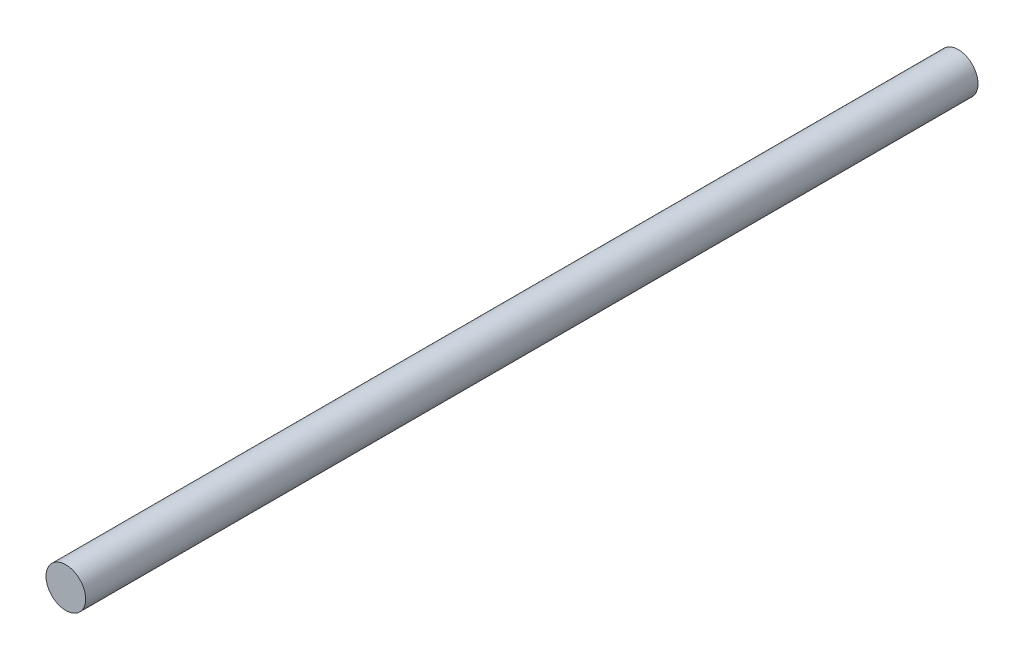
ISO-10303-21;
HEADER;
FILE_DESCRIPTION(('STEP AP214'),'2;1');
FILE_NAME('part.step','',(''),(''),'','','');
FILE_SCHEMA(('AUTOMOTIVE_DESIGN { 1 0 10303 214 1 1 1 1 }'));
ENDSEC;
DATA;
#1=APPLICATION_CONTEXT('core data for automotive mechanical design processes');
#2=APPLICATION_PROTOCOL_DEFINITION('international standard','automotive_design',2000,#1);
#3=PRODUCT_CONTEXT('',#1,'mechanical');
#4=PRODUCT('Part','Part','',(#3));
#5=PRODUCT_RELATED_PRODUCT_CATEGORY('part','',(#4));
#6=PRODUCT_DEFINITION_FORMATION('','',#4);
#7=PRODUCT_DEFINITION_CONTEXT('part definition',#1,'design');
#8=PRODUCT_DEFINITION('design','',#6,#7);
#9=PRODUCT_DEFINITION_SHAPE('','',#8);
#10=(LENGTH_UNIT() NAMED_UNIT(*) SI_UNIT(.MILLI.,.METRE.));
#11=(NAMED_UNIT(*) PLANE_ANGLE_UNIT() SI_UNIT($,.RADIAN.));
#12=(NAMED_UNIT(*) SI_UNIT($,.STERADIAN.) SOLID_ANGLE_UNIT());
#13=UNCERTAINTY_MEASURE_WITH_UNIT(LENGTH_MEASURE(1.E-05),#10,'distance_accuracy_value','');
#14=(GEOMETRIC_REPRESENTATION_CONTEXT(3) GLOBAL_UNCERTAINTY_ASSIGNED_CONTEXT((#13)) GLOBAL_UNIT_ASSIGNED_CONTEXT((#10,
#11,#12)) REPRESENTATION_CONTEXT('',''));
#15=CARTESIAN_POINT('',(0.,0.,0.));
#16=DIRECTION('',(0.,0.,1.));
#17=DIRECTION('',(1.,0.,0.));
#18=AXIS2_PLACEMENT_3D('',#15,#16,#17);
#19=CARTESIAN_POINT('',(0.,0.,180.));
#20=DIRECTION('',(0.,0.,-1.));
#21=DIRECTION('',(-1.,0.,0.));
#22=AXIS2_PLACEMENT_3D('',#19,#20,#21);
#23=CYLINDRICAL_SURFACE('',#22,4.);
#24=CARTESIAN_POINT('',(0.,0.,180.));
#25=DIRECTION('',(0.,0.,1.));
#26=DIRECTION('',(1.,0.,0.));
#27=AXIS2_PLACEMENT_3D('',#24,#25,#26);
#28=CIRCLE('',#27,4.);
#29=CARTESIAN_POINT('',(-4.,0.,180.));
#30=VERTEX_POINT('',#29);
#31=EDGE_CURVE('E10',#30,#30,#28,.T.);
#32=CARTESIAN_POINT('',(0.,0.,0.));
#33=DIRECTION('',(0.,0.,1.));
#34=DIRECTION('',(1.,0.,0.));
#35=AXIS2_PLACEMENT_3D('',#32,#33,#34);
#36=CIRCLE('',#35,4.);
#37=CARTESIAN_POINT('',(-4.,0.,0.));
#38=VERTEX_POINT('',#37);
#39=EDGE_CURVE('E46',#38,#38,#36,.T.);
#40=CARTESIAN_POINT('',(-4.,0.,180.));
#41=CARTESIAN_POINT('',(-4.,0.,178.125));
#42=CARTESIAN_POINT('',(-4.,0.,176.25));
#43=CARTESIAN_POINT('',(-4.,0.,172.5));
#44=CARTESIAN_POINT('',(-4.,0.,170.625));
#45=CARTESIAN_POINT('',(-4.,0.,166.875));
#46=CARTESIAN_POINT('',(-4.,0.,165.));
#47=CARTESIAN_POINT('',(-4.,0.,161.25));
#48=CARTESIAN_POINT('',(-4.,0.,159.375));
#49=CARTESIAN_POINT('',(-4.,0.,155.625));
#50=CARTESIAN_POINT('',(-4.,0.,153.75));
#51=CARTESIAN_POINT('',(-4.,0.,150.));
#52=CARTESIAN_POINT('',(-4.,0.,148.125));
#53=CARTESIAN_POINT('',(-4.,0.,144.375));
#54=CARTESIAN_POINT('',(-4.,0.,142.5));
#55=CARTESIAN_POINT('',(-4.,0.,138.75));
#56=CARTESIAN_POINT('',(-4.,0.,136.875));
#57=CARTESIAN_POINT('',(-4.,0.,133.125));
#58=CARTESIAN_POINT('',(-4.,0.,131.25));
#59=CARTESIAN_POINT('',(-4.,0.,127.5));
#60=CARTESIAN_POINT('',(-4.,0.,125.625));
#61=CARTESIAN_POINT('',(-4.,0.,121.875));
#62=CARTESIAN_POINT('',(-4.,0.,120.));
#63=CARTESIAN_POINT('',(-4.,0.,116.25));
#64=CARTESIAN_POINT('',(-4.,0.,114.375));
#65=CARTESIAN_POINT('',(-4.,0.,110.625));
#66=CARTESIAN_POINT('',(-4.,0.,108.75));
#67=CARTESIAN_POINT('',(-4.,0.,105.));
#68=CARTESIAN_POINT('',(-4.,0.,103.125));
#69=CARTESIAN_POINT('',(-4.,0.,99.375));
#70=CARTESIAN_POINT('',(-4.,0.,97.5));
#71=CARTESIAN_POINT('',(-4.,0.,93.75));
#72=CARTESIAN_POINT('',(-4.,0.,91.875));
#73=CARTESIAN_POINT('',(-4.,0.,88.125));
#74=CARTESIAN_POINT('',(-4.,0.,86.25));
#75=CARTESIAN_POINT('',(-4.,0.,82.5));
#76=CARTESIAN_POINT('',(-4.,0.,80.625));
#77=CARTESIAN_POINT('',(-4.,0.,76.875));
#78=CARTESIAN_POINT('',(-4.,0.,75.));
#79=CARTESIAN_POINT('',(-4.,0.,71.25));
#80=CARTESIAN_POINT('',(-4.,0.,69.375));
#81=CARTESIAN_POINT('',(-4.,0.,65.625));
#82=CARTESIAN_POINT('',(-4.,0.,63.75));
#83=CARTESIAN_POINT('',(-4.,0.,60.));
#84=CARTESIAN_POINT('',(-4.,0.,58.125));
#85=CARTESIAN_POINT('',(-4.,0.,54.375));
#86=CARTESIAN_POINT('',(-4.,0.,52.5));
#87=CARTESIAN_POINT('',(-4.,0.,48.75));
#88=CARTESIAN_POINT('',(-4.,0.,46.875));
#89=CARTESIAN_POINT('',(-4.,0.,43.125));
#90=CARTESIAN_POINT('',(-4.,0.,41.25));
#91=CARTESIAN_POINT('',(-4.,0.,37.5));
#92=CARTESIAN_POINT('',(-4.,0.,35.625));
#93=CARTESIAN_POINT('',(-4.,0.,31.875));
#94=CARTESIAN_POINT('',(-4.,0.,30.));
#95=CARTESIAN_POINT('',(-4.,0.,26.25));
#96=CARTESIAN_POINT('',(-4.,0.,24.375));
#97=CARTESIAN_POINT('',(-4.,0.,20.625));
#98=CARTESIAN_POINT('',(-4.,0.,18.75));
#99=CARTESIAN_POINT('',(-4.,0.,15.));
#100=CARTESIAN_POINT('',(-4.,0.,13.125));
#101=CARTESIAN_POINT('',(-4.,0.,9.37499999999998));
#102=CARTESIAN_POINT('',(-4.,0.,7.49999999999997));
#103=CARTESIAN_POINT('',(-4.,0.,3.74999999999997));
#104=CARTESIAN_POINT('',(-4.,0.,1.87499999999997));
#105=CARTESIAN_POINT('',(-4.,0.,0.));
#106=B_SPLINE_CURVE_WITH_KNOTS('',3,(#40,#41,#42,#43,#44,#45,#46,#47,#48,#49,#50,#51,#52,#53,
#54,#55,#56,#57,#58,#59,#60,#61,#62,#63,#64,#65,#66,#67,#68,#69,#70,#71,#72,#73,#74,#75,#76,#77,
#78,#79,#80,#81,#82,#83,#84,#85,#86,#87,#88,#89,#90,#91,#92,#93,#94,#95,#96,#97,#98,#99,#100,
#101,#102,#103,#104,#105),.UNSPECIFIED.,.F.,.F.,(4,2,2,2,2,2,2,2,2,2,2,2,2,2,2,2,2,2,2,2,2,2,2,
2,2,2,2,2,2,2,2,2,4),(0.,5.62499999999999,11.25,16.875,22.5,28.125,33.75,39.375,45.,50.625,
56.25,61.875,67.5,73.125,78.75,84.375,90.,95.625,101.25,106.875,112.5,118.125,123.75,129.375,
135.,140.625,146.25,151.875,157.5,163.125,168.75,174.375,180.),.UNSPECIFIED.);
#107=EDGE_CURVE('BSEAM43',#30,#38,#106,.T.);
#108=ORIENTED_EDGE('',*,*,#31,.F.);
#109=ORIENTED_EDGE('',*,*,#39,.T.);
#110=ORIENTED_EDGE('',*,*,#107,.T.);
#111=ORIENTED_EDGE('',*,*,#107,.F.);
#112=EDGE_LOOP('',(#108,#110,#109,#111));
#113=FACE_BOUND('',#112,.T.);
#114=ADVANCED_FACE('F43',(#113),#23,.T.);
#115=CARTESIAN_POINT('',(0.,0.,180.));
#116=DIRECTION('',(0.,0.,1.));
#117=DIRECTION('',(1.,0.,0.));
#118=AXIS2_PLACEMENT_3D('',#115,#116,#117);
#119=PLANE('',#118);
#120=ORIENTED_EDGE('',*,*,#31,.T.);
#121=EDGE_LOOP('',(#120));
#122=FACE_BOUND('',#121,.T.);
#123=ADVANCED_FACE('F60',(#122),#119,.T.);
#124=CARTESIAN_POINT('',(0.,0.,0.));
#125=DIRECTION('',(0.,0.,1.));
#126=DIRECTION('',(1.,0.,0.));
#127=AXIS2_PLACEMENT_3D('',#124,#125,#126);
#128=PLANE('',#127);
#129=ORIENTED_EDGE('',*,*,#39,.F.);
#130=EDGE_LOOP('',(#129));
#131=FACE_BOUND('',#130,.T.);
#132=ADVANCED_FACE('F58',(#131),#128,.F.);
#133=CLOSED_SHELL('',(#114,#123,#132));
#134=MANIFOLD_SOLID_BREP('B2',#133);
#135=ADVANCED_BREP_SHAPE_REPRESENTATION('',(#18,#134),#14);
#136=SHAPE_DEFINITION_REPRESENTATION(#9,#135);
ENDSEC;
END-ISO-10303-21;
